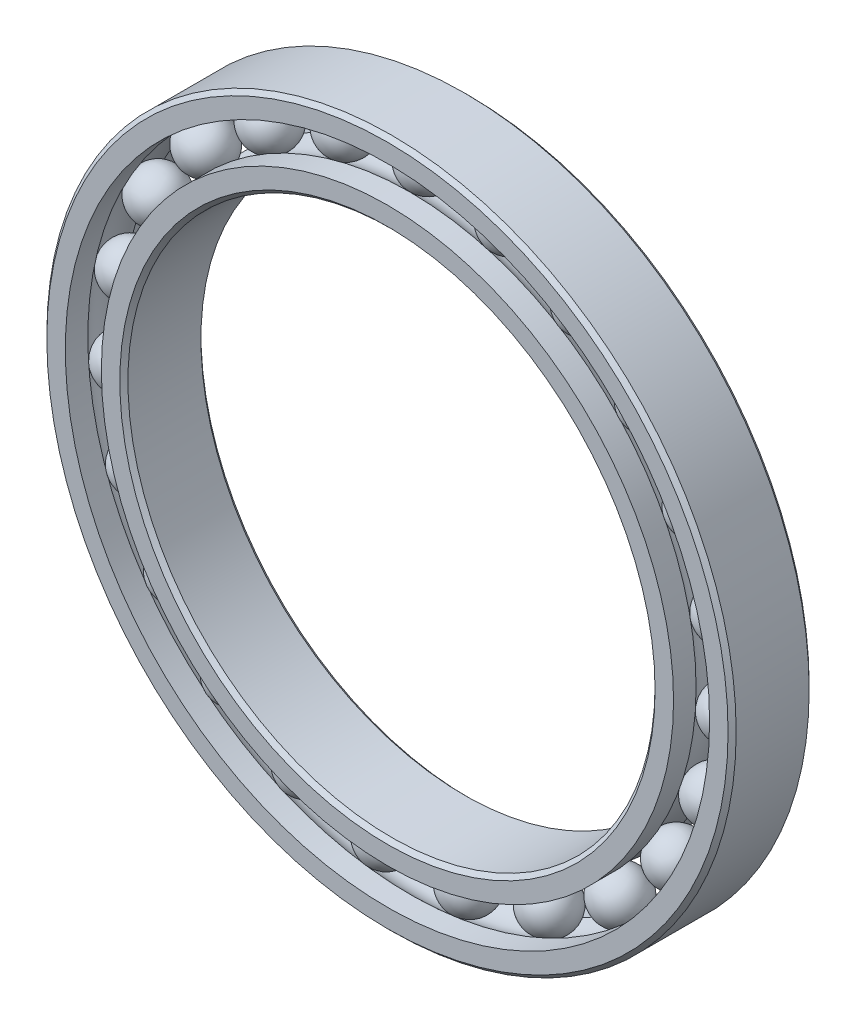
ISO-10303-21;
HEADER;
FILE_DESCRIPTION(('STEP AP214'),'2;1');
FILE_NAME('part.step','',(''),(''),'','','');
FILE_SCHEMA(('AUTOMOTIVE_DESIGN { 1 0 10303 214 1 1 1 1 }'));
ENDSEC;
DATA;
#1=APPLICATION_CONTEXT('core data for automotive mechanical design processes');
#2=APPLICATION_PROTOCOL_DEFINITION('international standard','automotive_design',2000,#1);
#3=PRODUCT_CONTEXT('',#1,'mechanical');
#4=PRODUCT('Part','Part','',(#3));
#5=PRODUCT_RELATED_PRODUCT_CATEGORY('part','',(#4));
#6=PRODUCT_DEFINITION_FORMATION('','',#4);
#7=PRODUCT_DEFINITION_CONTEXT('part definition',#1,'design');
#8=PRODUCT_DEFINITION('design','',#6,#7);
#9=PRODUCT_DEFINITION_SHAPE('','',#8);
#10=(LENGTH_UNIT() NAMED_UNIT(*) SI_UNIT(.MILLI.,.METRE.));
#11=(NAMED_UNIT(*) PLANE_ANGLE_UNIT() SI_UNIT($,.RADIAN.));
#12=(NAMED_UNIT(*) SI_UNIT($,.STERADIAN.) SOLID_ANGLE_UNIT());
#13=UNCERTAINTY_MEASURE_WITH_UNIT(LENGTH_MEASURE(1.E-05),#10,'distance_accuracy_value','');
#14=(GEOMETRIC_REPRESENTATION_CONTEXT(3) GLOBAL_UNCERTAINTY_ASSIGNED_CONTEXT((#13)) GLOBAL_UNIT_ASSIGNED_CONTEXT((#10,
#11,#12)) REPRESENTATION_CONTEXT('',''));
#15=CARTESIAN_POINT('',(0.,0.,0.));
#16=DIRECTION('',(0.,0.,1.));
#17=DIRECTION('',(1.,0.,0.));
#18=AXIS2_PLACEMENT_3D('',#15,#16,#17);
#19=CARTESIAN_POINT('',(10.1173789183879,36.1093982755426,0.));
#20=DIRECTION('',(0.,0.,1.));
#21=DIRECTION('',(0.269796771157012,0.962917287347803,0.));
#22=AXIS2_PLACEMENT_3D('',#19,#20,#21);
#23=SPHERICAL_SURFACE('',#22,3.14269680527354);
#24=CARTESIAN_POINT('',(10.1173789183879,36.1093982755426,3.14269680527355));
#25=VERTEX_POINT('',#24);
#26=VERTEX_LOOP('',#25);
#27=FACE_BOUND('',#26,.T.);
#28=ADVANCED_FACE('F37',(#27),#23,.T.);
#29=CLOSED_SHELL('',(#28));
#30=MANIFOLD_SOLID_BREP('B2',#29);
#31=CARTESIAN_POINT('',(19.4843981263284,32.0407276704936,0.));
#32=DIRECTION('',(0.,0.,1.));
#33=DIRECTION('',(0.519583950035423,0.854419404546495,0.));
#34=AXIS2_PLACEMENT_3D('',#31,#32,#33);
#35=SPHERICAL_SURFACE('',#34,3.14269680527354);
#36=CARTESIAN_POINT('',(19.4843981263284,32.0407276704936,3.14269680527355));
#37=VERTEX_POINT('',#36);
#38=VERTEX_LOOP('',#37);
#39=FACE_BOUND('',#38,.T.);
#40=ADVANCED_FACE('F55',(#39),#35,.T.);
#41=CLOSED_SHELL('',(#40));
#42=MANIFOLD_SOLID_BREP('B6',#41);
#43=CARTESIAN_POINT('',(27.4063486604294,25.5957428706999,0.));
#44=DIRECTION('',(0.,0.,1.));
#45=DIRECTION('',(0.730835964278116,0.682553143218663,0.));
#46=AXIS2_PLACEMENT_3D('',#43,#44,#45);
#47=SPHERICAL_SURFACE('',#46,3.14269680527354);
#48=CARTESIAN_POINT('',(27.4063486604294,25.5957428706999,3.14269680527355));
#49=VERTEX_POINT('',#48);
#50=VERTEX_LOOP('',#49);
#51=FACE_BOUND('',#50,.T.);
#52=ADVANCED_FACE('F73',(#51),#47,.T.);
#53=CLOSED_SHELL('',(#52));
#54=MANIFOLD_SOLID_BREP('B33',#53);
#55=CARTESIAN_POINT('',(33.2956956900889,17.2524389149186,0.));
#56=DIRECTION('',(0.,0.,1.));
#57=DIRECTION('',(0.88788521840237,0.460065037731162,0.));
#58=AXIS2_PLACEMENT_3D('',#55,#56,#57);
#59=SPHERICAL_SURFACE('',#58,3.14269680527354);
#60=CARTESIAN_POINT('',(33.2956956900889,17.2524389149186,3.14269680527355));
#61=VERTEX_POINT('',#60);
#62=VERTEX_LOOP('',#61);
#63=FACE_BOUND('',#62,.T.);
#64=ADVANCED_FACE('F91',(#63),#59,.T.);
#65=CLOSED_SHELL('',(#64));
#66=MANIFOLD_SOLID_BREP('B51',#65);
#67=CARTESIAN_POINT('',(36.715653288087,7.62960048947418,0.));
#68=DIRECTION('',(0.,0.,1.));
#69=DIRECTION('',(0.979084087682321,0.203456013052645,0.));
#70=AXIS2_PLACEMENT_3D('',#67,#68,#69);
#71=SPHERICAL_SURFACE('',#70,3.14269680527354);
#72=CARTESIAN_POINT('',(36.715653288087,7.62960048947418,3.14269680527355));
#73=VERTEX_POINT('',#72);
#74=VERTEX_LOOP('',#73);
#75=FACE_BOUND('',#74,.T.);
#76=ADVANCED_FACE('F109',(#75),#71,.T.);
#77=CLOSED_SHELL('',(#76));
#78=MANIFOLD_SOLID_BREP('B69',#77);
#79=CARTESIAN_POINT('',(37.4125788446453,-2.55909050117478,0.));
#80=DIRECTION('',(0.,0.,1.));
#81=DIRECTION('',(0.99766876919054,-0.0682424133646607,0.));
#82=AXIS2_PLACEMENT_3D('',#79,#80,#81);
#83=SPHERICAL_SURFACE('',#82,3.14269680527354);
#84=CARTESIAN_POINT('',(37.4125788446453,-2.55909050117478,3.14269680527355));
#85=VERTEX_POINT('',#84);
#86=VERTEX_LOOP('',#85);
#87=FACE_BOUND('',#86,.T.);
#88=ADVANCED_FACE('F127',(#87),#83,.T.);
#89=CLOSED_SHELL('',(#88));
#90=MANIFOLD_SOLID_BREP('B87',#89);
#91=CARTESIAN_POINT('',(35.3347845794559,-12.5579854564116,0.));
#92=DIRECTION('',(0.,0.,1.));
#93=DIRECTION('',(0.942260922118824,-0.334879612170977,0.));
#94=AXIS2_PLACEMENT_3D('',#91,#92,#93);
#95=SPHERICAL_SURFACE('',#94,3.14269680527354);
#96=CARTESIAN_POINT('',(35.3347845794559,-12.5579854564116,3.14269680527355));
#97=VERTEX_POINT('',#96);
#98=VERTEX_LOOP('',#97);
#99=FACE_BOUND('',#98,.T.);
#100=ADVANCED_FACE('F147',(#99),#95,.T.);
#101=CLOSED_SHELL('',(#100));
#102=MANIFOLD_SOLID_BREP('B105',#101);
#103=CARTESIAN_POINT('',(30.6363709878918,-21.6255120793073,0.));
#104=DIRECTION('',(0.,0.,1.));
#105=DIRECTION('',(0.816969893010447,-0.57668032211486,0.));
#106=AXIS2_PLACEMENT_3D('',#103,#104,#105);
#107=SPHERICAL_SURFACE('',#106,3.14269680527354);
#108=CARTESIAN_POINT('',(30.6363709878918,-21.6255120793073,3.14269680527355));
#109=VERTEX_POINT('',#108);
#110=VERTEX_LOOP('',#109);
#111=FACE_BOUND('',#110,.T.);
#112=ADVANCED_FACE('F167',(#111),#107,.T.);
#113=CLOSED_SHELL('',(#112));
#114=MANIFOLD_SOLID_BREP('B123',#113);
#115=CARTESIAN_POINT('',(23.6657979122272,-29.0891734014155,0.));
#116=DIRECTION('',(0.,0.,1.));
#117=DIRECTION('',(0.631087944326059,-0.775711290704414,0.));
#118=AXIS2_PLACEMENT_3D('',#115,#116,#117);
#119=SPHERICAL_SURFACE('',#118,3.14269680527354);
#120=CARTESIAN_POINT('',(23.6657979122272,-29.0891734014155,3.14269680527355));
#121=VERTEX_POINT('',#120);
#122=VERTEX_LOOP('',#121);
#123=FACE_BOUND('',#122,.T.);
#124=ADVANCED_FACE('F187',(#123),#119,.T.);
#125=CLOSED_SHELL('',(#124));
#126=MANIFOLD_SOLID_BREP('B143',#125);
#127=CARTESIAN_POINT('',(14.9400408692343,-34.3954238064544,0.));
#128=DIRECTION('',(0.,0.,1.));
#129=DIRECTION('',(0.398401089846249,-0.91721130150545,0.));
#130=AXIS2_PLACEMENT_3D('',#127,#128,#129);
#131=SPHERICAL_SURFACE('',#130,3.14269680527354);
#132=CARTESIAN_POINT('',(14.9400408692343,-34.3954238064544,3.14269680527355));
#133=VERTEX_POINT('',#132);
#134=VERTEX_LOOP('',#133);
#135=FACE_BOUND('',#134,.T.);
#136=ADVANCED_FACE('F207',(#135),#131,.T.);
#137=CLOSED_SHELL('',(#136));
#138=MANIFOLD_SOLID_BREP('B163',#137);
#139=CARTESIAN_POINT('',(5.10624934110952,-37.1507229763624,0.));
#140=DIRECTION('',(0.,0.,1.));
#141=DIRECTION('',(0.136166649096254,-0.99068594603633,0.));
#142=AXIS2_PLACEMENT_3D('',#139,#140,#141);
#143=SPHERICAL_SURFACE('',#142,3.14269680527354);
#144=CARTESIAN_POINT('',(5.10624934110952,-37.1507229763624,3.14269680527355));
#145=VERTEX_POINT('',#144);
#146=VERTEX_LOOP('',#145);
#147=FACE_BOUND('',#146,.T.);
#148=ADVANCED_FACE('F227',(#147),#143,.T.);
#149=CLOSED_SHELL('',(#148));
#150=MANIFOLD_SOLID_BREP('B183',#149);
#151=CARTESIAN_POINT('',(-5.106249341109,-37.1507229763624,0.));
#152=DIRECTION('',(0.,0.,1.));
#153=DIRECTION('',(-0.13616664909624,-0.990685946036332,0.));
#154=AXIS2_PLACEMENT_3D('',#151,#152,#153);
#155=SPHERICAL_SURFACE('',#154,3.14269680527354);
#156=CARTESIAN_POINT('',(-5.106249341109,-37.1507229763624,3.14269680527355));
#157=VERTEX_POINT('',#156);
#158=VERTEX_LOOP('',#157);
#159=FACE_BOUND('',#158,.T.);
#160=ADVANCED_FACE('F247',(#159),#155,.T.);
#161=CLOSED_SHELL('',(#160));
#162=MANIFOLD_SOLID_BREP('B203',#161);
#163=CARTESIAN_POINT('',(-14.9400408692339,-34.3954238064546,0.));
#164=DIRECTION('',(0.,0.,1.));
#165=DIRECTION('',(-0.398401089846236,-0.917211301505455,0.));
#166=AXIS2_PLACEMENT_3D('',#163,#164,#165);
#167=SPHERICAL_SURFACE('',#166,3.14269680527354);
#168=CARTESIAN_POINT('',(-14.9400408692339,-34.3954238064546,3.14269680527355));
#169=VERTEX_POINT('',#168);
#170=VERTEX_LOOP('',#169);
#171=FACE_BOUND('',#170,.T.);
#172=ADVANCED_FACE('F267',(#171),#167,.T.);
#173=CLOSED_SHELL('',(#172));
#174=MANIFOLD_SOLID_BREP('B223',#173);
#175=CARTESIAN_POINT('',(-23.6657979122268,-29.0891734014159,0.));
#176=DIRECTION('',(0.,0.,1.));
#177=DIRECTION('',(-0.631087944326049,-0.775711290704423,0.));
#178=AXIS2_PLACEMENT_3D('',#175,#176,#177);
#179=SPHERICAL_SURFACE('',#178,3.14269680527354);
#180=CARTESIAN_POINT('',(-23.6657979122268,-29.0891734014159,3.14269680527355));
#181=VERTEX_POINT('',#180);
#182=VERTEX_LOOP('',#181);
#183=FACE_BOUND('',#182,.T.);
#184=ADVANCED_FACE('F287',(#183),#179,.T.);
#185=CLOSED_SHELL('',(#184));
#186=MANIFOLD_SOLID_BREP('B243',#185);
#187=CARTESIAN_POINT('',(-30.6363709878915,-21.6255120793077,0.));
#188=DIRECTION('',(0.,0.,1.));
#189=DIRECTION('',(-0.816969893010439,-0.576680322114871,0.));
#190=AXIS2_PLACEMENT_3D('',#187,#188,#189);
#191=SPHERICAL_SURFACE('',#190,3.14269680527354);
#192=CARTESIAN_POINT('',(-30.6363709878915,-21.6255120793077,3.14269680527355));
#193=VERTEX_POINT('',#192);
#194=VERTEX_LOOP('',#193);
#195=FACE_BOUND('',#194,.T.);
#196=ADVANCED_FACE('F307',(#195),#191,.T.);
#197=CLOSED_SHELL('',(#196));
#198=MANIFOLD_SOLID_BREP('B263',#197);
#199=CARTESIAN_POINT('',(-35.3347845794557,-12.5579854564121,0.));
#200=DIRECTION('',(0.,0.,1.));
#201=DIRECTION('',(-0.942260922118819,-0.33487961217099,0.));
#202=AXIS2_PLACEMENT_3D('',#199,#200,#201);
#203=SPHERICAL_SURFACE('',#202,3.14269680527354);
#204=CARTESIAN_POINT('',(-35.3347845794557,-12.5579854564121,3.14269680527355));
#205=VERTEX_POINT('',#204);
#206=VERTEX_LOOP('',#205);
#207=FACE_BOUND('',#206,.T.);
#208=ADVANCED_FACE('F327',(#207),#203,.T.);
#209=CLOSED_SHELL('',(#208));
#210=MANIFOLD_SOLID_BREP('B283',#209);
#211=CARTESIAN_POINT('',(-37.4125788446452,-2.5590905011753,0.));
#212=DIRECTION('',(0.,0.,1.));
#213=DIRECTION('',(-0.997668769190539,-0.0682424133646747,0.));
#214=AXIS2_PLACEMENT_3D('',#211,#212,#213);
#215=SPHERICAL_SURFACE('',#214,3.14269680527354);
#216=CARTESIAN_POINT('',(-37.4125788446452,-2.5590905011753,3.14269680527355));
#217=VERTEX_POINT('',#216);
#218=VERTEX_LOOP('',#217);
#219=FACE_BOUND('',#218,.T.);
#220=ADVANCED_FACE('F347',(#219),#215,.T.);
#221=CLOSED_SHELL('',(#220));
#222=MANIFOLD_SOLID_BREP('B303',#221);
#223=CARTESIAN_POINT('',(-36.7156532880871,7.62960048947366,0.));
#224=DIRECTION('',(0.,0.,1.));
#225=DIRECTION('',(-0.979084087682323,0.203456013052631,0.));
#226=AXIS2_PLACEMENT_3D('',#223,#224,#225);
#227=SPHERICAL_SURFACE('',#226,3.14269680527354);
#228=CARTESIAN_POINT('',(-36.7156532880871,7.62960048947366,3.14269680527355));
#229=VERTEX_POINT('',#228);
#230=VERTEX_LOOP('',#229);
#231=FACE_BOUND('',#230,.T.);
#232=ADVANCED_FACE('F367',(#231),#227,.T.);
#233=CLOSED_SHELL('',(#232));
#234=MANIFOLD_SOLID_BREP('B323',#233);
#235=CARTESIAN_POINT('',(-33.2956956900891,17.2524389149181,0.));
#236=DIRECTION('',(0.,0.,1.));
#237=DIRECTION('',(-0.887885218402376,0.46006503773115,0.));
#238=AXIS2_PLACEMENT_3D('',#235,#236,#237);
#239=SPHERICAL_SURFACE('',#238,3.14269680527354);
#240=CARTESIAN_POINT('',(-33.2956956900891,17.2524389149181,3.14269680527355));
#241=VERTEX_POINT('',#240);
#242=VERTEX_LOOP('',#241);
#243=FACE_BOUND('',#242,.T.);
#244=ADVANCED_FACE('F387',(#243),#239,.T.);
#245=CLOSED_SHELL('',(#244));
#246=MANIFOLD_SOLID_BREP('B343',#245);
#247=CARTESIAN_POINT('',(-27.4063486604297,25.5957428706995,0.));
#248=DIRECTION('',(0.,0.,1.));
#249=DIRECTION('',(-0.730835964278125,0.682553143218653,0.));
#250=AXIS2_PLACEMENT_3D('',#247,#248,#249);
#251=SPHERICAL_SURFACE('',#250,3.14269680527354);
#252=CARTESIAN_POINT('',(-27.4063486604297,25.5957428706995,3.14269680527355));
#253=VERTEX_POINT('',#252);
#254=VERTEX_LOOP('',#253);
#255=FACE_BOUND('',#254,.T.);
#256=ADVANCED_FACE('F407',(#255),#251,.T.);
#257=CLOSED_SHELL('',(#256));
#258=MANIFOLD_SOLID_BREP('B363',#257);
#259=CARTESIAN_POINT('',(-19.4843981263288,32.0407276704933,0.));
#260=DIRECTION('',(0.,0.,1.));
#261=DIRECTION('',(-0.519583950035435,0.854419404546488,0.));
#262=AXIS2_PLACEMENT_3D('',#259,#260,#261);
#263=SPHERICAL_SURFACE('',#262,3.14269680527354);
#264=CARTESIAN_POINT('',(-19.4843981263288,32.0407276704933,3.14269680527355));
#265=VERTEX_POINT('',#264);
#266=VERTEX_LOOP('',#265);
#267=FACE_BOUND('',#266,.T.);
#268=ADVANCED_FACE('F427',(#267),#263,.T.);
#269=CLOSED_SHELL('',(#268));
#270=MANIFOLD_SOLID_BREP('B383',#269);
#271=CARTESIAN_POINT('',(-10.1173789183884,36.1093982755425,0.));
#272=DIRECTION('',(0.,0.,1.));
#273=DIRECTION('',(-0.269796771157025,0.962917287347799,0.));
#274=AXIS2_PLACEMENT_3D('',#271,#272,#273);
#275=SPHERICAL_SURFACE('',#274,3.14269680527354);
#276=CARTESIAN_POINT('',(-10.1173789183884,36.1093982755425,3.14269680527355));
#277=VERTEX_POINT('',#276);
#278=VERTEX_LOOP('',#277);
#279=FACE_BOUND('',#278,.T.);
#280=ADVANCED_FACE('F447',(#279),#275,.T.);
#281=CLOSED_SHELL('',(#280));
#282=MANIFOLD_SOLID_BREP('B403',#281);
#283=CARTESIAN_POINT('',(0.,37.5,0.));
#284=DIRECTION('',(0.,0.,1.));
#285=DIRECTION('',(0.,1.,0.));
#286=AXIS2_PLACEMENT_3D('',#283,#284,#285);
#287=SPHERICAL_SURFACE('',#286,3.14269680527354);
#288=CARTESIAN_POINT('',(0.,37.5,3.14269680527355));
#289=VERTEX_POINT('',#288);
#290=VERTEX_LOOP('',#289);
#291=FACE_BOUND('',#290,.T.);
#292=ADVANCED_FACE('F469',(#291),#287,.T.);
#293=CLOSED_SHELL('',(#292));
#294=MANIFOLD_SOLID_BREP('B423',#293);
#295=CARTESIAN_POINT('',(0.,35.2777777777778,5.));
#296=DIRECTION('',(0.,0.,-1.));
#297=DIRECTION('',(-1.,0.,0.));
#298=AXIS2_PLACEMENT_3D('',#295,#296,#297);
#299=PLANE('',#298);
#300=CARTESIAN_POINT('',(0.,0.,5.));
#301=DIRECTION('',(0.,0.,1.));
#302=DIRECTION('',(1.,0.,0.));
#303=AXIS2_PLACEMENT_3D('',#300,#301,#302);
#304=CIRCLE('',#303,33.);
#305=CARTESIAN_POINT('',(33.,0.,5.));
#306=VERTEX_POINT('',#305);
#307=EDGE_CURVE('E516',#306,#306,#304,.T.);
#308=ORIENTED_EDGE('',*,*,#307,.F.);
#309=EDGE_LOOP('',(#308));
#310=FACE_BOUND('',#309,.T.);
#311=CARTESIAN_POINT('',(0.,0.,5.));
#312=DIRECTION('',(0.,0.,1.));
#313=DIRECTION('',(1.,0.,0.));
#314=AXIS2_PLACEMENT_3D('',#311,#312,#313);
#315=CIRCLE('',#314,35.2777777777778);
#316=CARTESIAN_POINT('',(35.2777777777778,0.,5.));
#317=VERTEX_POINT('',#316);
#318=EDGE_CURVE('E468',#317,#317,#315,.T.);
#319=ORIENTED_EDGE('',*,*,#318,.T.);
#320=EDGE_LOOP('',(#319));
#321=FACE_BOUND('',#320,.T.);
#322=ADVANCED_FACE('F488',(#310,#321),#299,.F.);
#323=CARTESIAN_POINT('',(0.,0.,5.));
#324=DIRECTION('',(0.,0.,1.));
#325=DIRECTION('',(1.,0.,0.));
#326=AXIS2_PLACEMENT_3D('',#323,#324,#325);
#327=CYLINDRICAL_SURFACE('',#326,35.2777777777778);
#328=ORIENTED_EDGE('',*,*,#318,.F.);
#329=EDGE_LOOP('',(#328));
#330=FACE_BOUND('',#329,.T.);
#331=CARTESIAN_POINT('',(0.,0.,2.22222222222223));
#332=DIRECTION('',(0.,0.,1.));
#333=DIRECTION('',(1.,0.,0.));
#334=AXIS2_PLACEMENT_3D('',#331,#332,#333);
#335=CIRCLE('',#334,35.2777777777778);
#336=CARTESIAN_POINT('',(35.2777777777778,0.,2.22222222222223));
#337=VERTEX_POINT('',#336);
#338=EDGE_CURVE('E494',#337,#337,#335,.T.);
#339=ORIENTED_EDGE('',*,*,#338,.T.);
#340=EDGE_LOOP('',(#339));
#341=FACE_BOUND('',#340,.T.);
#342=ADVANCED_FACE('F523',(#330,#341),#327,.T.);
#343=CARTESIAN_POINT('',(0.,0.,0.));
#344=DIRECTION('',(0.,0.,1.));
#345=DIRECTION('',(1.,0.,0.));
#346=AXIS2_PLACEMENT_3D('',#343,#344,#345);
#347=TOROIDAL_SURFACE('',#346,37.5,3.14269680527355);
#348=ORIENTED_EDGE('',*,*,#338,.F.);
#349=EDGE_LOOP('',(#348));
#350=FACE_BOUND('',#349,.T.);
#351=CARTESIAN_POINT('',(0.,0.,-2.22222222222223));
#352=DIRECTION('',(0.,0.,1.));
#353=DIRECTION('',(1.,0.,0.));
#354=AXIS2_PLACEMENT_3D('',#351,#352,#353);
#355=CIRCLE('',#354,35.2777777777778);
#356=CARTESIAN_POINT('',(35.2777777777778,0.,-2.22222222222223));
#357=VERTEX_POINT('',#356);
#358=EDGE_CURVE('E498',#357,#357,#355,.T.);
#359=ORIENTED_EDGE('',*,*,#358,.T.);
#360=EDGE_LOOP('',(#359));
#361=FACE_BOUND('',#360,.T.);
#362=ADVANCED_FACE('F527',(#350,#361),#347,.F.);
#363=CARTESIAN_POINT('',(0.,0.,5.));
#364=DIRECTION('',(0.,0.,1.));
#365=DIRECTION('',(1.,0.,0.));
#366=AXIS2_PLACEMENT_3D('',#363,#364,#365);
#367=CYLINDRICAL_SURFACE('',#366,35.2777777777778);
#368=ORIENTED_EDGE('',*,*,#358,.F.);
#369=EDGE_LOOP('',(#368));
#370=FACE_BOUND('',#369,.T.);
#371=CARTESIAN_POINT('',(0.,0.,-5.));
#372=DIRECTION('',(0.,0.,1.));
#373=DIRECTION('',(1.,0.,0.));
#374=AXIS2_PLACEMENT_3D('',#371,#372,#373);
#375=CIRCLE('',#374,35.2777777777778);
#376=CARTESIAN_POINT('',(35.2777777777778,0.,-5.));
#377=VERTEX_POINT('',#376);
#378=EDGE_CURVE('E502',#377,#377,#375,.T.);
#379=ORIENTED_EDGE('',*,*,#378,.T.);
#380=EDGE_LOOP('',(#379));
#381=FACE_BOUND('',#380,.T.);
#382=ADVANCED_FACE('F532',(#370,#381),#367,.T.);
#383=CARTESIAN_POINT('',(0.,33.,-5.));
#384=DIRECTION('',(0.,0.,1.));
#385=DIRECTION('',(1.,0.,0.));
#386=AXIS2_PLACEMENT_3D('',#383,#384,#385);
#387=PLANE('',#386);
#388=ORIENTED_EDGE('',*,*,#378,.F.);
#389=EDGE_LOOP('',(#388));
#390=FACE_BOUND('',#389,.T.);
#391=CARTESIAN_POINT('',(0.,0.,-5.));
#392=DIRECTION('',(0.,0.,1.));
#393=DIRECTION('',(1.,0.,0.));
#394=AXIS2_PLACEMENT_3D('',#391,#392,#393);
#395=CIRCLE('',#394,33.);
#396=CARTESIAN_POINT('',(33.,0.,-5.));
#397=VERTEX_POINT('',#396);
#398=EDGE_CURVE('E507',#397,#397,#395,.T.);
#399=ORIENTED_EDGE('',*,*,#398,.T.);
#400=EDGE_LOOP('',(#399));
#401=FACE_BOUND('',#400,.T.);
#402=ADVANCED_FACE('F538',(#390,#401),#387,.F.);
#403=CARTESIAN_POINT('',(0.,0.,-4.49999999999999));
#404=DIRECTION('',(0.,0.,-1.));
#405=DIRECTION('',(-1.,0.,0.));
#406=AXIS2_PLACEMENT_3D('',#403,#404,#405);
#407=CONICAL_SURFACE('',#406,32.5,0.785398163397445);
#408=ORIENTED_EDGE('',*,*,#398,.F.);
#409=EDGE_LOOP('',(#408));
#410=FACE_BOUND('',#409,.T.);
#411=CARTESIAN_POINT('',(0.,0.,-4.49999999999999));
#412=DIRECTION('',(0.,0.,1.));
#413=DIRECTION('',(1.,0.,0.));
#414=AXIS2_PLACEMENT_3D('',#411,#412,#413);
#415=CIRCLE('',#414,32.5);
#416=CARTESIAN_POINT('',(32.5,0.,-4.49999999999999));
#417=VERTEX_POINT('',#416);
#418=EDGE_CURVE('E510',#417,#417,#415,.T.);
#419=ORIENTED_EDGE('',*,*,#418,.T.);
#420=EDGE_LOOP('',(#419));
#421=FACE_BOUND('',#420,.T.);
#422=ADVANCED_FACE('F542',(#410,#421),#407,.F.);
#423=CARTESIAN_POINT('',(0.,0.,5.));
#424=DIRECTION('',(0.,0.,1.));
#425=DIRECTION('',(1.,0.,0.));
#426=AXIS2_PLACEMENT_3D('',#423,#424,#425);
#427=CYLINDRICAL_SURFACE('',#426,32.5);
#428=ORIENTED_EDGE('',*,*,#418,.F.);
#429=EDGE_LOOP('',(#428));
#430=FACE_BOUND('',#429,.T.);
#431=CARTESIAN_POINT('',(0.,0.,4.5));
#432=DIRECTION('',(0.,0.,1.));
#433=DIRECTION('',(1.,0.,0.));
#434=AXIS2_PLACEMENT_3D('',#431,#432,#433);
#435=CIRCLE('',#434,32.5);
#436=CARTESIAN_POINT('',(32.5,0.,4.5));
#437=VERTEX_POINT('',#436);
#438=EDGE_CURVE('E513',#437,#437,#435,.T.);
#439=ORIENTED_EDGE('',*,*,#438,.T.);
#440=EDGE_LOOP('',(#439));
#441=FACE_BOUND('',#440,.T.);
#442=ADVANCED_FACE('F546',(#430,#441),#427,.F.);
#443=CARTESIAN_POINT('',(0.,0.,5.));
#444=DIRECTION('',(0.,0.,1.));
#445=DIRECTION('',(1.,0.,0.));
#446=AXIS2_PLACEMENT_3D('',#443,#444,#445);
#447=CONICAL_SURFACE('',#446,33.,0.785398163397449);
#448=ORIENTED_EDGE('',*,*,#438,.F.);
#449=EDGE_LOOP('',(#448));
#450=FACE_BOUND('',#449,.T.);
#451=ORIENTED_EDGE('',*,*,#307,.T.);
#452=EDGE_LOOP('',(#451));
#453=FACE_BOUND('',#452,.T.);
#454=ADVANCED_FACE('F520',(#450,#453),#447,.F.);
#455=CLOSED_SHELL('',(#322,#342,#362,#382,#402,#422,#442,#454));
#456=MANIFOLD_SOLID_BREP('B443',#455);
#457=CARTESIAN_POINT('',(0.,0.,4.5));
#458=DIRECTION('',(0.,0.,-1.));
#459=DIRECTION('',(-1.,0.,0.));
#460=AXIS2_PLACEMENT_3D('',#457,#458,#459);
#461=CONICAL_SURFACE('',#460,42.5,0.785398163397445);
#462=CARTESIAN_POINT('',(0.,0.,5.00000000000001));
#463=DIRECTION('',(0.,0.,1.));
#464=DIRECTION('',(1.,0.,0.));
#465=AXIS2_PLACEMENT_3D('',#462,#463,#464);
#466=CIRCLE('',#465,42.);
#467=CARTESIAN_POINT('',(42.,0.,5.00000000000001));
#468=VERTEX_POINT('',#467);
#469=EDGE_CURVE('E637',#468,#468,#466,.T.);
#470=ORIENTED_EDGE('',*,*,#469,.F.);
#471=EDGE_LOOP('',(#470));
#472=FACE_BOUND('',#471,.T.);
#473=CARTESIAN_POINT('',(0.,0.,4.5));
#474=DIRECTION('',(0.,0.,1.));
#475=DIRECTION('',(1.,0.,0.));
#476=AXIS2_PLACEMENT_3D('',#473,#474,#475);
#477=CIRCLE('',#476,42.5);
#478=CARTESIAN_POINT('',(42.5,0.,4.5));
#479=VERTEX_POINT('',#478);
#480=EDGE_CURVE('E487',#479,#479,#477,.T.);
#481=ORIENTED_EDGE('',*,*,#480,.T.);
#482=EDGE_LOOP('',(#481));
#483=FACE_BOUND('',#482,.T.);
#484=ADVANCED_FACE('F609',(#472,#483),#461,.T.);
#485=CARTESIAN_POINT('',(0.,0.,5.));
#486=DIRECTION('',(0.,0.,1.));
#487=DIRECTION('',(1.,0.,0.));
#488=AXIS2_PLACEMENT_3D('',#485,#486,#487);
#489=CYLINDRICAL_SURFACE('',#488,42.5);
#490=ORIENTED_EDGE('',*,*,#480,.F.);
#491=EDGE_LOOP('',(#490));
#492=FACE_BOUND('',#491,.T.);
#493=CARTESIAN_POINT('',(0.,0.,-4.49999999999999));
#494=DIRECTION('',(0.,0.,1.));
#495=DIRECTION('',(1.,0.,0.));
#496=AXIS2_PLACEMENT_3D('',#493,#494,#495);
#497=CIRCLE('',#496,42.5);
#498=CARTESIAN_POINT('',(42.5,0.,-4.49999999999999));
#499=VERTEX_POINT('',#498);
#500=EDGE_CURVE('E615',#499,#499,#497,.T.);
#501=ORIENTED_EDGE('',*,*,#500,.T.);
#502=EDGE_LOOP('',(#501));
#503=FACE_BOUND('',#502,.T.);
#504=ADVANCED_FACE('F644',(#492,#503),#489,.T.);
#505=CARTESIAN_POINT('',(0.,0.,-5.));
#506=DIRECTION('',(0.,0.,1.));
#507=DIRECTION('',(1.,0.,0.));
#508=AXIS2_PLACEMENT_3D('',#505,#506,#507);
#509=CONICAL_SURFACE('',#508,42.,0.785398163397445);
#510=ORIENTED_EDGE('',*,*,#500,.F.);
#511=EDGE_LOOP('',(#510));
#512=FACE_BOUND('',#511,.T.);
#513=CARTESIAN_POINT('',(0.,0.,-5.));
#514=DIRECTION('',(0.,0.,1.));
#515=DIRECTION('',(1.,0.,0.));
#516=AXIS2_PLACEMENT_3D('',#513,#514,#515);
#517=CIRCLE('',#516,42.);
#518=CARTESIAN_POINT('',(42.,0.,-5.));
#519=VERTEX_POINT('',#518);
#520=EDGE_CURVE('E619',#519,#519,#517,.T.);
#521=ORIENTED_EDGE('',*,*,#520,.T.);
#522=EDGE_LOOP('',(#521));
#523=FACE_BOUND('',#522,.T.);
#524=ADVANCED_FACE('F648',(#512,#523),#509,.T.);
#525=CARTESIAN_POINT('',(0.,42.,-5.));
#526=DIRECTION('',(0.,0.,1.));
#527=DIRECTION('',(1.,0.,0.));
#528=AXIS2_PLACEMENT_3D('',#525,#526,#527);
#529=PLANE('',#528);
#530=ORIENTED_EDGE('',*,*,#520,.F.);
#531=EDGE_LOOP('',(#530));
#532=FACE_BOUND('',#531,.T.);
#533=CARTESIAN_POINT('',(0.,0.,-5.));
#534=DIRECTION('',(0.,0.,1.));
#535=DIRECTION('',(1.,0.,0.));
#536=AXIS2_PLACEMENT_3D('',#533,#534,#535);
#537=CIRCLE('',#536,39.7222222222222);
#538=CARTESIAN_POINT('',(39.7222222222222,0.,-5.));
#539=VERTEX_POINT('',#538);
#540=EDGE_CURVE('E623',#539,#539,#537,.T.);
#541=ORIENTED_EDGE('',*,*,#540,.T.);
#542=EDGE_LOOP('',(#541));
#543=FACE_BOUND('',#542,.T.);
#544=ADVANCED_FACE('F653',(#532,#543),#529,.F.);
#545=CARTESIAN_POINT('',(0.,0.,5.));
#546=DIRECTION('',(0.,0.,1.));
#547=DIRECTION('',(1.,0.,0.));
#548=AXIS2_PLACEMENT_3D('',#545,#546,#547);
#549=CYLINDRICAL_SURFACE('',#548,39.7222222222222);
#550=ORIENTED_EDGE('',*,*,#540,.F.);
#551=EDGE_LOOP('',(#550));
#552=FACE_BOUND('',#551,.T.);
#553=CARTESIAN_POINT('',(0.,0.,-2.22222222222222));
#554=DIRECTION('',(0.,0.,1.));
#555=DIRECTION('',(1.,0.,0.));
#556=AXIS2_PLACEMENT_3D('',#553,#554,#555);
#557=CIRCLE('',#556,39.7222222222222);
#558=CARTESIAN_POINT('',(39.7222222222222,0.,-2.22222222222222));
#559=VERTEX_POINT('',#558);
#560=EDGE_CURVE('E628',#559,#559,#557,.T.);
#561=ORIENTED_EDGE('',*,*,#560,.T.);
#562=EDGE_LOOP('',(#561));
#563=FACE_BOUND('',#562,.T.);
#564=ADVANCED_FACE('F659',(#552,#563),#549,.F.);
#565=CARTESIAN_POINT('',(0.,0.,0.));
#566=DIRECTION('',(0.,0.,1.));
#567=DIRECTION('',(1.,0.,0.));
#568=AXIS2_PLACEMENT_3D('',#565,#566,#567);
#569=TOROIDAL_SURFACE('',#568,37.5,3.14269680527354);
#570=ORIENTED_EDGE('',*,*,#560,.F.);
#571=EDGE_LOOP('',(#570));
#572=FACE_BOUND('',#571,.T.);
#573=CARTESIAN_POINT('',(0.,0.,2.22222222222223));
#574=DIRECTION('',(0.,0.,1.));
#575=DIRECTION('',(1.,0.,0.));
#576=AXIS2_PLACEMENT_3D('',#573,#574,#575);
#577=CIRCLE('',#576,39.7222222222222);
#578=CARTESIAN_POINT('',(39.7222222222222,0.,2.22222222222223));
#579=VERTEX_POINT('',#578);
#580=EDGE_CURVE('E631',#579,#579,#577,.T.);
#581=ORIENTED_EDGE('',*,*,#580,.T.);
#582=EDGE_LOOP('',(#581));
#583=FACE_BOUND('',#582,.T.);
#584=ADVANCED_FACE('F663',(#572,#583),#569,.F.);
#585=CARTESIAN_POINT('',(0.,0.,5.));
#586=DIRECTION('',(0.,0.,1.));
#587=DIRECTION('',(1.,0.,0.));
#588=AXIS2_PLACEMENT_3D('',#585,#586,#587);
#589=CYLINDRICAL_SURFACE('',#588,39.7222222222222);
#590=ORIENTED_EDGE('',*,*,#580,.F.);
#591=EDGE_LOOP('',(#590));
#592=FACE_BOUND('',#591,.T.);
#593=CARTESIAN_POINT('',(0.,0.,5.00000000000001));
#594=DIRECTION('',(0.,0.,1.));
#595=DIRECTION('',(1.,0.,0.));
#596=AXIS2_PLACEMENT_3D('',#593,#594,#595);
#597=CIRCLE('',#596,39.7222222222222);
#598=CARTESIAN_POINT('',(39.7222222222222,0.,5.00000000000001));
#599=VERTEX_POINT('',#598);
#600=EDGE_CURVE('E634',#599,#599,#597,.T.);
#601=ORIENTED_EDGE('',*,*,#600,.T.);
#602=EDGE_LOOP('',(#601));
#603=FACE_BOUND('',#602,.T.);
#604=ADVANCED_FACE('F667',(#592,#603),#589,.F.);
#605=CARTESIAN_POINT('',(0.,42.,5.00000000000001));
#606=DIRECTION('',(0.,0.,-1.));
#607=DIRECTION('',(-1.,0.,0.));
#608=AXIS2_PLACEMENT_3D('',#605,#606,#607);
#609=PLANE('',#608);
#610=ORIENTED_EDGE('',*,*,#600,.F.);
#611=EDGE_LOOP('',(#610));
#612=FACE_BOUND('',#611,.T.);
#613=ORIENTED_EDGE('',*,*,#469,.T.);
#614=EDGE_LOOP('',(#613));
#615=FACE_BOUND('',#614,.T.);
#616=ADVANCED_FACE('F641',(#612,#615),#609,.F.);
#617=CLOSED_SHELL('',(#484,#504,#524,#544,#564,#584,#604,#616));
#618=MANIFOLD_SOLID_BREP('B463',#617);
#619=ADVANCED_BREP_SHAPE_REPRESENTATION('',(#18,#30,#42,#54,#66,#78,#90,#102,#114,#126,#138,
#150,#162,#174,#186,#198,#210,#222,#234,#246,#258,#270,#282,#294,#456,#618),#14);
#620=SHAPE_DEFINITION_REPRESENTATION(#9,#619);
ENDSEC;
END-ISO-10303-21;
